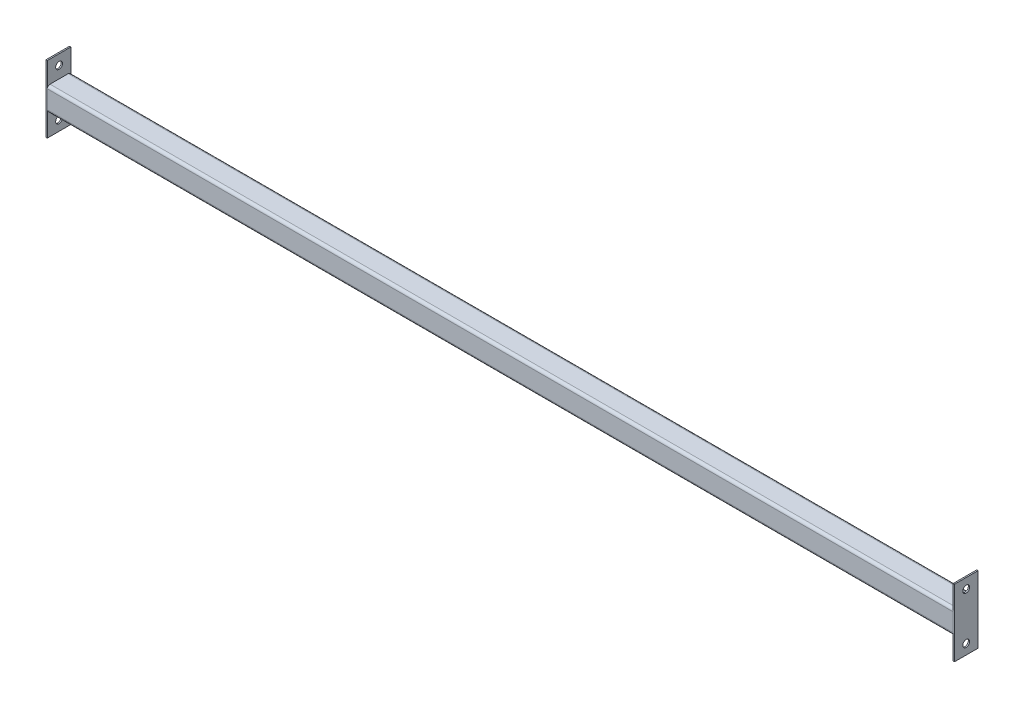
ISO-10303-21;
HEADER;
FILE_DESCRIPTION(('STEP AP214'),'2;1');
FILE_NAME('part.step','',(''),(''),'','','');
FILE_SCHEMA(('AUTOMOTIVE_DESIGN { 1 0 10303 214 1 1 1 1 }'));
ENDSEC;
DATA;
#1=APPLICATION_CONTEXT('core data for automotive mechanical design processes');
#2=APPLICATION_PROTOCOL_DEFINITION('international standard','automotive_design',2000,#1);
#3=PRODUCT_CONTEXT('',#1,'mechanical');
#4=PRODUCT('Part','Part','',(#3));
#5=PRODUCT_RELATED_PRODUCT_CATEGORY('part','',(#4));
#6=PRODUCT_DEFINITION_FORMATION('','',#4);
#7=PRODUCT_DEFINITION_CONTEXT('part definition',#1,'design');
#8=PRODUCT_DEFINITION('design','',#6,#7);
#9=PRODUCT_DEFINITION_SHAPE('','',#8);
#10=(LENGTH_UNIT() NAMED_UNIT(*) SI_UNIT(.MILLI.,.METRE.));
#11=(NAMED_UNIT(*) PLANE_ANGLE_UNIT() SI_UNIT($,.RADIAN.));
#12=(NAMED_UNIT(*) SI_UNIT($,.STERADIAN.) SOLID_ANGLE_UNIT());
#13=UNCERTAINTY_MEASURE_WITH_UNIT(LENGTH_MEASURE(1.E-05),#10,'distance_accuracy_value','');
#14=(GEOMETRIC_REPRESENTATION_CONTEXT(3) GLOBAL_UNCERTAINTY_ASSIGNED_CONTEXT((#13)) GLOBAL_UNIT_ASSIGNED_CONTEXT((#10,
#11,#12)) REPRESENTATION_CONTEXT('',''));
#15=CARTESIAN_POINT('',(0.,0.,0.));
#16=DIRECTION('',(0.,0.,1.));
#17=DIRECTION('',(1.,0.,0.));
#18=AXIS2_PLACEMENT_3D('',#15,#16,#17);
#19=CARTESIAN_POINT('',(1349.,50.,0.));
#20=DIRECTION('',(-1.,0.,0.));
#21=DIRECTION('',(0.,0.,1.));
#22=AXIS2_PLACEMENT_3D('',#19,#20,#21);
#23=PLANE('',#22);
#24=CARTESIAN_POINT('',(1349.,63.5,13.5));
#25=DIRECTION('',(-1.,0.,0.));
#26=DIRECTION('',(0.,0.,1.));
#27=AXIS2_PLACEMENT_3D('',#24,#25,#26);
#28=CIRCLE('',#27,2.);
#29=CARTESIAN_POINT('',(1349.,63.5,15.5));
#30=VERTEX_POINT('',#29);
#31=CARTESIAN_POINT('',(1349.,65.5,13.5));
#32=VERTEX_POINT('',#31);
#33=EDGE_CURVE('E201',#30,#32,#28,.T.);
#34=ORIENTED_EDGE('',*,*,#33,.T.);
#35=DIRECTION('',(0.,0.,-1.));
#36=VECTOR('',#35,1.);
#37=CARTESIAN_POINT('',(1349.,65.5,-13.5));
#38=LINE('',#37,#36);
#39=CARTESIAN_POINT('',(1349.,65.5,-13.5));
#40=VERTEX_POINT('',#39);
#41=EDGE_CURVE('E198',#32,#40,#38,.T.);
#42=ORIENTED_EDGE('',*,*,#41,.T.);
#43=CARTESIAN_POINT('',(1349.,63.5,-13.5));
#44=DIRECTION('',(-1.,0.,0.));
#45=DIRECTION('',(0.,0.,1.));
#46=AXIS2_PLACEMENT_3D('',#43,#44,#45);
#47=CIRCLE('',#46,2.);
#48=CARTESIAN_POINT('',(1349.,63.5,-15.5));
#49=VERTEX_POINT('',#48);
#50=EDGE_CURVE('E195',#40,#49,#47,.T.);
#51=ORIENTED_EDGE('',*,*,#50,.T.);
#52=DIRECTION('',(0.,-1.,0.));
#53=VECTOR('',#52,1.);
#54=CARTESIAN_POINT('',(1349.,63.5,-15.5));
#55=LINE('',#54,#53);
#56=CARTESIAN_POINT('',(1349.,36.5,-15.5));
#57=VERTEX_POINT('',#56);
#58=EDGE_CURVE('E192',#49,#57,#55,.T.);
#59=ORIENTED_EDGE('',*,*,#58,.T.);
#60=CARTESIAN_POINT('',(1349.,36.5,-13.5));
#61=DIRECTION('',(-1.,0.,0.));
#62=DIRECTION('',(0.,0.,1.));
#63=AXIS2_PLACEMENT_3D('',#60,#61,#62);
#64=CIRCLE('',#63,1.99999999999999);
#65=CARTESIAN_POINT('',(1349.,34.5,-13.5));
#66=VERTEX_POINT('',#65);
#67=EDGE_CURVE('E189',#57,#66,#64,.T.);
#68=ORIENTED_EDGE('',*,*,#67,.T.);
#69=DIRECTION('',(0.,0.,1.));
#70=VECTOR('',#69,1.);
#71=CARTESIAN_POINT('',(1349.,34.5,13.5));
#72=LINE('',#71,#70);
#73=CARTESIAN_POINT('',(1349.,34.5,13.5));
#74=VERTEX_POINT('',#73);
#75=EDGE_CURVE('E186',#66,#74,#72,.T.);
#76=ORIENTED_EDGE('',*,*,#75,.T.);
#77=CARTESIAN_POINT('',(1349.,36.5,13.5));
#78=DIRECTION('',(-1.,0.,0.));
#79=DIRECTION('',(0.,0.,1.));
#80=AXIS2_PLACEMENT_3D('',#77,#78,#79);
#81=CIRCLE('',#80,1.99999999999999);
#82=CARTESIAN_POINT('',(1349.,36.5,15.5));
#83=VERTEX_POINT('',#82);
#84=EDGE_CURVE('E183',#74,#83,#81,.T.);
#85=ORIENTED_EDGE('',*,*,#84,.T.);
#86=DIRECTION('',(0.,1.,0.));
#87=VECTOR('',#86,1.);
#88=CARTESIAN_POINT('',(1349.,36.5,15.5));
#89=LINE('',#88,#87);
#90=EDGE_CURVE('E180',#83,#30,#89,.T.);
#91=ORIENTED_EDGE('',*,*,#90,.T.);
#92=EDGE_LOOP('',(#34,#42,#51,#59,#68,#76,#85,#91));
#93=FACE_BOUND('',#92,.T.);
#94=DIRECTION('',(0.,0.,-1.));
#95=VECTOR('',#94,1.);
#96=CARTESIAN_POINT('',(1349.,67.5,-13.5));
#97=LINE('',#96,#95);
#98=CARTESIAN_POINT('',(1349.,67.5,13.5));
#99=VERTEX_POINT('',#98);
#100=CARTESIAN_POINT('',(1349.,67.5,-13.5));
#101=VERTEX_POINT('',#100);
#102=EDGE_CURVE('E144',#99,#101,#97,.T.);
#103=ORIENTED_EDGE('',*,*,#102,.F.);
#104=CARTESIAN_POINT('',(1349.,63.5,13.5));
#105=DIRECTION('',(-1.,0.,0.));
#106=DIRECTION('',(0.,0.,1.));
#107=AXIS2_PLACEMENT_3D('',#104,#105,#106);
#108=CIRCLE('',#107,4.);
#109=CARTESIAN_POINT('',(1349.,63.5,17.5));
#110=VERTEX_POINT('',#109);
#111=EDGE_CURVE('E147',#110,#99,#108,.T.);
#112=ORIENTED_EDGE('',*,*,#111,.F.);
#113=DIRECTION('',(0.,1.,0.));
#114=VECTOR('',#113,1.);
#115=CARTESIAN_POINT('',(1349.,36.5,17.5));
#116=LINE('',#115,#114);
#117=CARTESIAN_POINT('',(1349.,36.5,17.5));
#118=VERTEX_POINT('',#117);
#119=EDGE_CURVE('E177',#118,#110,#116,.T.);
#120=ORIENTED_EDGE('',*,*,#119,.F.);
#121=CARTESIAN_POINT('',(1349.,36.5,13.5));
#122=DIRECTION('',(-1.,0.,0.));
#123=DIRECTION('',(0.,0.,1.));
#124=AXIS2_PLACEMENT_3D('',#121,#122,#123);
#125=CIRCLE('',#124,4.);
#126=CARTESIAN_POINT('',(1349.,32.5,13.5));
#127=VERTEX_POINT('',#126);
#128=EDGE_CURVE('E219',#127,#118,#125,.T.);
#129=ORIENTED_EDGE('',*,*,#128,.F.);
#130=DIRECTION('',(0.,0.,1.));
#131=VECTOR('',#130,1.);
#132=CARTESIAN_POINT('',(1349.,32.5,13.5));
#133=LINE('',#132,#131);
#134=CARTESIAN_POINT('',(1349.,32.5,-13.5));
#135=VERTEX_POINT('',#134);
#136=EDGE_CURVE('E214',#135,#127,#133,.T.);
#137=ORIENTED_EDGE('',*,*,#136,.F.);
#138=CARTESIAN_POINT('',(1349.,36.5,-13.5));
#139=DIRECTION('',(-1.,0.,0.));
#140=DIRECTION('',(0.,0.,1.));
#141=AXIS2_PLACEMENT_3D('',#138,#139,#140);
#142=CIRCLE('',#141,4.);
#143=CARTESIAN_POINT('',(1349.,36.5,-17.5));
#144=VERTEX_POINT('',#143);
#145=EDGE_CURVE('E209',#144,#135,#142,.T.);
#146=ORIENTED_EDGE('',*,*,#145,.F.);
#147=DIRECTION('',(0.,-1.,0.));
#148=VECTOR('',#147,1.);
#149=CARTESIAN_POINT('',(1349.,63.5,-17.5));
#150=LINE('',#149,#148);
#151=CARTESIAN_POINT('',(1349.,63.5,-17.5));
#152=VERTEX_POINT('',#151);
#153=EDGE_CURVE('E205',#152,#144,#150,.T.);
#154=ORIENTED_EDGE('',*,*,#153,.F.);
#155=CARTESIAN_POINT('',(1349.,63.5,-13.5));
#156=DIRECTION('',(-1.,0.,0.));
#157=DIRECTION('',(0.,0.,1.));
#158=AXIS2_PLACEMENT_3D('',#155,#156,#157);
#159=CIRCLE('',#158,4.);
#160=EDGE_CURVE('E151',#101,#152,#159,.T.);
#161=ORIENTED_EDGE('',*,*,#160,.F.);
#162=EDGE_LOOP('',(#103,#112,#120,#129,#137,#146,#154,#161));
#163=FACE_BOUND('',#162,.T.);
#164=ADVANCED_FACE('F87',(#93,#163),#23,.F.);
#165=CARTESIAN_POINT('',(1350.,63.5,13.5));
#166=DIRECTION('',(-1.,0.,0.));
#167=DIRECTION('',(0.,0.,1.));
#168=AXIS2_PLACEMENT_3D('',#165,#166,#167);
#169=CYLINDRICAL_SURFACE('',#168,2.);
#170=ORIENTED_EDGE('',*,*,#33,.F.);
#171=DIRECTION('',(-1.,0.,0.));
#172=VECTOR('',#171,1.);
#173=CARTESIAN_POINT('',(1350.,63.5,15.5));
#174=LINE('',#173,#172);
#175=CARTESIAN_POINT('',(0.99999999999989,63.5,15.5));
#176=VERTEX_POINT('',#175);
#177=EDGE_CURVE('E90',#30,#176,#174,.T.);
#178=ORIENTED_EDGE('',*,*,#177,.T.);
#179=CARTESIAN_POINT('',(0.99999999999989,63.5,13.5));
#180=DIRECTION('',(1.,0.,0.));
#181=DIRECTION('',(0.,0.,-1.));
#182=AXIS2_PLACEMENT_3D('',#179,#180,#181);
#183=CIRCLE('',#182,2.);
#184=CARTESIAN_POINT('',(0.99999999999989,65.5,13.5));
#185=VERTEX_POINT('',#184);
#186=EDGE_CURVE('E228',#185,#176,#183,.T.);
#187=ORIENTED_EDGE('',*,*,#186,.F.);
#188=DIRECTION('',(-1.,0.,0.));
#189=VECTOR('',#188,1.);
#190=CARTESIAN_POINT('',(1350.,65.5,13.5));
#191=LINE('',#190,#189);
#192=EDGE_CURVE('E243',#32,#185,#191,.T.);
#193=ORIENTED_EDGE('',*,*,#192,.F.);
#194=EDGE_LOOP('',(#170,#178,#187,#193));
#195=FACE_BOUND('',#194,.T.);
#196=ADVANCED_FACE('F254',(#195),#169,.F.);
#197=CARTESIAN_POINT('',(1350.,65.5,-13.5));
#198=DIRECTION('',(0.,-1.,0.));
#199=DIRECTION('',(0.,0.,-1.));
#200=AXIS2_PLACEMENT_3D('',#197,#198,#199);
#201=PLANE('',#200);
#202=ORIENTED_EDGE('',*,*,#41,.F.);
#203=ORIENTED_EDGE('',*,*,#192,.T.);
#204=DIRECTION('',(0.,0.,1.));
#205=VECTOR('',#204,1.);
#206=CARTESIAN_POINT('',(0.99999999999989,65.5,-13.5));
#207=LINE('',#206,#205);
#208=CARTESIAN_POINT('',(0.99999999999989,65.5,-13.5));
#209=VERTEX_POINT('',#208);
#210=EDGE_CURVE('E267',#209,#185,#207,.T.);
#211=ORIENTED_EDGE('',*,*,#210,.F.);
#212=DIRECTION('',(-1.,0.,0.));
#213=VECTOR('',#212,1.);
#214=CARTESIAN_POINT('',(1350.,65.5,-13.5));
#215=LINE('',#214,#213);
#216=EDGE_CURVE('E241',#40,#209,#215,.T.);
#217=ORIENTED_EDGE('',*,*,#216,.F.);
#218=EDGE_LOOP('',(#202,#203,#211,#217));
#219=FACE_BOUND('',#218,.T.);
#220=ADVANCED_FACE('F376',(#219),#201,.T.);
#221=CARTESIAN_POINT('',(1350.,63.5,-13.5));
#222=DIRECTION('',(-1.,0.,0.));
#223=DIRECTION('',(0.,0.,1.));
#224=AXIS2_PLACEMENT_3D('',#221,#222,#223);
#225=CYLINDRICAL_SURFACE('',#224,2.);
#226=ORIENTED_EDGE('',*,*,#50,.F.);
#227=ORIENTED_EDGE('',*,*,#216,.T.);
#228=CARTESIAN_POINT('',(0.99999999999989,63.5,-13.5));
#229=DIRECTION('',(1.,0.,0.));
#230=DIRECTION('',(0.,0.,-1.));
#231=AXIS2_PLACEMENT_3D('',#228,#229,#230);
#232=CIRCLE('',#231,2.);
#233=CARTESIAN_POINT('',(0.99999999999989,63.5,-15.5));
#234=VERTEX_POINT('',#233);
#235=EDGE_CURVE('E368',#234,#209,#232,.T.);
#236=ORIENTED_EDGE('',*,*,#235,.F.);
#237=DIRECTION('',(-1.,0.,0.));
#238=VECTOR('',#237,1.);
#239=CARTESIAN_POINT('',(1350.,63.5,-15.5));
#240=LINE('',#239,#238);
#241=EDGE_CURVE('E238',#49,#234,#240,.T.);
#242=ORIENTED_EDGE('',*,*,#241,.F.);
#243=EDGE_LOOP('',(#226,#227,#236,#242));
#244=FACE_BOUND('',#243,.T.);
#245=ADVANCED_FACE('F377',(#244),#225,.F.);
#246=CARTESIAN_POINT('',(1350.,63.5,-15.5));
#247=DIRECTION('',(0.,0.,1.));
#248=DIRECTION('',(1.,0.,0.));
#249=AXIS2_PLACEMENT_3D('',#246,#247,#248);
#250=PLANE('',#249);
#251=ORIENTED_EDGE('',*,*,#58,.F.);
#252=ORIENTED_EDGE('',*,*,#241,.T.);
#253=DIRECTION('',(0.,1.,0.));
#254=VECTOR('',#253,1.);
#255=CARTESIAN_POINT('',(0.99999999999989,63.5,-15.5));
#256=LINE('',#255,#254);
#257=CARTESIAN_POINT('',(0.99999999999989,36.5,-15.5));
#258=VERTEX_POINT('',#257);
#259=EDGE_CURVE('E366',#258,#234,#256,.T.);
#260=ORIENTED_EDGE('',*,*,#259,.F.);
#261=DIRECTION('',(-1.,0.,0.));
#262=VECTOR('',#261,1.);
#263=CARTESIAN_POINT('',(1350.,36.5,-15.5));
#264=LINE('',#263,#262);
#265=EDGE_CURVE('E235',#57,#258,#264,.T.);
#266=ORIENTED_EDGE('',*,*,#265,.F.);
#267=EDGE_LOOP('',(#251,#252,#260,#266));
#268=FACE_BOUND('',#267,.T.);
#269=ADVANCED_FACE('F379',(#268),#250,.T.);
#270=CARTESIAN_POINT('',(1350.,36.5,-13.5));
#271=DIRECTION('',(-1.,0.,0.));
#272=DIRECTION('',(0.,0.,1.));
#273=AXIS2_PLACEMENT_3D('',#270,#271,#272);
#274=CYLINDRICAL_SURFACE('',#273,1.99999999999999);
#275=ORIENTED_EDGE('',*,*,#67,.F.);
#276=ORIENTED_EDGE('',*,*,#265,.T.);
#277=CARTESIAN_POINT('',(0.99999999999989,36.5,-13.5));
#278=DIRECTION('',(1.,0.,0.));
#279=DIRECTION('',(0.,0.,-1.));
#280=AXIS2_PLACEMENT_3D('',#277,#278,#279);
#281=CIRCLE('',#280,1.99999999999999);
#282=CARTESIAN_POINT('',(0.99999999999989,34.5,-13.5));
#283=VERTEX_POINT('',#282);
#284=EDGE_CURVE('E363',#283,#258,#281,.T.);
#285=ORIENTED_EDGE('',*,*,#284,.F.);
#286=DIRECTION('',(-1.,0.,0.));
#287=VECTOR('',#286,1.);
#288=CARTESIAN_POINT('',(1350.,34.5,-13.5));
#289=LINE('',#288,#287);
#290=EDGE_CURVE('E232',#66,#283,#289,.T.);
#291=ORIENTED_EDGE('',*,*,#290,.F.);
#292=EDGE_LOOP('',(#275,#276,#285,#291));
#293=FACE_BOUND('',#292,.T.);
#294=ADVANCED_FACE('F360',(#293),#274,.F.);
#295=CARTESIAN_POINT('',(1350.,34.5,13.5));
#296=DIRECTION('',(0.,1.,0.));
#297=DIRECTION('',(0.,0.,1.));
#298=AXIS2_PLACEMENT_3D('',#295,#296,#297);
#299=PLANE('',#298);
#300=ORIENTED_EDGE('',*,*,#75,.F.);
#301=ORIENTED_EDGE('',*,*,#290,.T.);
#302=DIRECTION('',(0.,0.,-1.));
#303=VECTOR('',#302,1.);
#304=CARTESIAN_POINT('',(0.99999999999989,34.5,13.5));
#305=LINE('',#304,#303);
#306=CARTESIAN_POINT('',(0.99999999999989,34.5,13.5));
#307=VERTEX_POINT('',#306);
#308=EDGE_CURVE('E273',#307,#283,#305,.T.);
#309=ORIENTED_EDGE('',*,*,#308,.F.);
#310=DIRECTION('',(-1.,0.,0.));
#311=VECTOR('',#310,1.);
#312=CARTESIAN_POINT('',(1350.,34.5,13.5));
#313=LINE('',#312,#311);
#314=EDGE_CURVE('E229',#74,#307,#313,.T.);
#315=ORIENTED_EDGE('',*,*,#314,.F.);
#316=EDGE_LOOP('',(#300,#301,#309,#315));
#317=FACE_BOUND('',#316,.T.);
#318=ADVANCED_FACE('F355',(#317),#299,.T.);
#319=CARTESIAN_POINT('',(1350.,36.5,13.5));
#320=DIRECTION('',(-1.,0.,0.));
#321=DIRECTION('',(0.,0.,1.));
#322=AXIS2_PLACEMENT_3D('',#319,#320,#321);
#323=CYLINDRICAL_SURFACE('',#322,1.99999999999999);
#324=ORIENTED_EDGE('',*,*,#84,.F.);
#325=ORIENTED_EDGE('',*,*,#314,.T.);
#326=CARTESIAN_POINT('',(0.99999999999989,36.5,13.5));
#327=DIRECTION('',(1.,0.,0.));
#328=DIRECTION('',(0.,0.,-1.));
#329=AXIS2_PLACEMENT_3D('',#326,#327,#328);
#330=CIRCLE('',#329,1.99999999999999);
#331=CARTESIAN_POINT('',(0.99999999999989,36.5,15.5));
#332=VERTEX_POINT('',#331);
#333=EDGE_CURVE('E271',#332,#307,#330,.T.);
#334=ORIENTED_EDGE('',*,*,#333,.F.);
#335=DIRECTION('',(-1.,0.,0.));
#336=VECTOR('',#335,1.);
#337=CARTESIAN_POINT('',(1350.,36.5,15.5));
#338=LINE('',#337,#336);
#339=EDGE_CURVE('E225',#83,#332,#338,.T.);
#340=ORIENTED_EDGE('',*,*,#339,.F.);
#341=EDGE_LOOP('',(#324,#325,#334,#340));
#342=FACE_BOUND('',#341,.T.);
#343=ADVANCED_FACE('F351',(#342),#323,.F.);
#344=CARTESIAN_POINT('',(1350.,36.5,15.5));
#345=DIRECTION('',(0.,0.,-1.));
#346=DIRECTION('',(-1.,0.,0.));
#347=AXIS2_PLACEMENT_3D('',#344,#345,#346);
#348=PLANE('',#347);
#349=ORIENTED_EDGE('',*,*,#90,.F.);
#350=ORIENTED_EDGE('',*,*,#339,.T.);
#351=DIRECTION('',(0.,-1.,0.));
#352=VECTOR('',#351,1.);
#353=CARTESIAN_POINT('',(0.99999999999989,36.5,15.5));
#354=LINE('',#353,#352);
#355=EDGE_CURVE('E264',#176,#332,#354,.T.);
#356=ORIENTED_EDGE('',*,*,#355,.F.);
#357=ORIENTED_EDGE('',*,*,#177,.F.);
#358=EDGE_LOOP('',(#349,#350,#356,#357));
#359=FACE_BOUND('',#358,.T.);
#360=ADVANCED_FACE('F269',(#359),#348,.T.);
#361=CARTESIAN_POINT('',(0.999999999999995,50.,0.));
#362=DIRECTION('',(1.,0.,0.));
#363=DIRECTION('',(0.,0.,-1.));
#364=AXIS2_PLACEMENT_3D('',#361,#362,#363);
#365=PLANE('',#364);
#366=ORIENTED_EDGE('',*,*,#186,.T.);
#367=ORIENTED_EDGE('',*,*,#355,.T.);
#368=ORIENTED_EDGE('',*,*,#333,.T.);
#369=ORIENTED_EDGE('',*,*,#308,.T.);
#370=ORIENTED_EDGE('',*,*,#284,.T.);
#371=ORIENTED_EDGE('',*,*,#259,.T.);
#372=ORIENTED_EDGE('',*,*,#235,.T.);
#373=ORIENTED_EDGE('',*,*,#210,.T.);
#374=EDGE_LOOP('',(#366,#367,#368,#369,#370,#371,#372,#373));
#375=FACE_BOUND('',#374,.T.);
#376=DIRECTION('',(0.,1.,0.));
#377=VECTOR('',#376,1.);
#378=CARTESIAN_POINT('',(0.99999999999989,63.5,-17.5));
#379=LINE('',#378,#377);
#380=CARTESIAN_POINT('',(0.99999999999989,36.5,-17.5));
#381=VERTEX_POINT('',#380);
#382=CARTESIAN_POINT('',(0.99999999999989,63.5,-17.5));
#383=VERTEX_POINT('',#382);
#384=EDGE_CURVE('E14',#381,#383,#379,.T.);
#385=ORIENTED_EDGE('',*,*,#384,.F.);
#386=CARTESIAN_POINT('',(0.99999999999989,36.5,-13.5));
#387=DIRECTION('',(1.,0.,0.));
#388=DIRECTION('',(0.,0.,-1.));
#389=AXIS2_PLACEMENT_3D('',#386,#387,#388);
#390=CIRCLE('',#389,4.);
#391=CARTESIAN_POINT('',(0.99999999999989,32.5,-13.5));
#392=VERTEX_POINT('',#391);
#393=EDGE_CURVE('E208',#392,#381,#390,.T.);
#394=ORIENTED_EDGE('',*,*,#393,.F.);
#395=DIRECTION('',(0.,0.,-1.));
#396=VECTOR('',#395,1.);
#397=CARTESIAN_POINT('',(0.99999999999989,32.5,13.5));
#398=LINE('',#397,#396);
#399=CARTESIAN_POINT('',(0.99999999999989,32.5,13.5));
#400=VERTEX_POINT('',#399);
#401=EDGE_CURVE('E213',#400,#392,#398,.T.);
#402=ORIENTED_EDGE('',*,*,#401,.F.);
#403=CARTESIAN_POINT('',(0.99999999999989,36.5,13.5));
#404=DIRECTION('',(1.,0.,0.));
#405=DIRECTION('',(0.,0.,-1.));
#406=AXIS2_PLACEMENT_3D('',#403,#404,#405);
#407=CIRCLE('',#406,4.);
#408=CARTESIAN_POINT('',(0.99999999999989,36.5,17.5));
#409=VERTEX_POINT('',#408);
#410=EDGE_CURVE('E218',#409,#400,#407,.T.);
#411=ORIENTED_EDGE('',*,*,#410,.F.);
#412=DIRECTION('',(0.,-1.,0.));
#413=VECTOR('',#412,1.);
#414=CARTESIAN_POINT('',(0.99999999999989,36.5,17.5));
#415=LINE('',#414,#413);
#416=CARTESIAN_POINT('',(0.99999999999989,63.5,17.5));
#417=VERTEX_POINT('',#416);
#418=EDGE_CURVE('E220',#417,#409,#415,.T.);
#419=ORIENTED_EDGE('',*,*,#418,.F.);
#420=CARTESIAN_POINT('',(0.99999999999989,63.5,13.5));
#421=DIRECTION('',(1.,0.,0.));
#422=DIRECTION('',(0.,0.,-1.));
#423=AXIS2_PLACEMENT_3D('',#420,#421,#422);
#424=CIRCLE('',#423,4.);
#425=CARTESIAN_POINT('',(0.99999999999989,67.5,13.5));
#426=VERTEX_POINT('',#425);
#427=EDGE_CURVE('E168',#426,#417,#424,.T.);
#428=ORIENTED_EDGE('',*,*,#427,.F.);
#429=DIRECTION('',(0.,0.,1.));
#430=VECTOR('',#429,1.);
#431=CARTESIAN_POINT('',(0.99999999999989,67.5,-13.5));
#432=LINE('',#431,#430);
#433=CARTESIAN_POINT('',(0.99999999999989,67.5,-13.5));
#434=VERTEX_POINT('',#433);
#435=EDGE_CURVE('E164',#434,#426,#432,.T.);
#436=ORIENTED_EDGE('',*,*,#435,.F.);
#437=CARTESIAN_POINT('',(0.99999999999989,63.5,-13.5));
#438=DIRECTION('',(1.,0.,0.));
#439=DIRECTION('',(0.,0.,-1.));
#440=AXIS2_PLACEMENT_3D('',#437,#438,#439);
#441=CIRCLE('',#440,4.);
#442=EDGE_CURVE('E156',#383,#434,#441,.T.);
#443=ORIENTED_EDGE('',*,*,#442,.F.);
#444=EDGE_LOOP('',(#385,#394,#402,#411,#419,#428,#436,#443));
#445=FACE_BOUND('',#444,.T.);
#446=ADVANCED_FACE('F260',(#375,#445),#365,.F.);
#447=CARTESIAN_POINT('',(1350.,63.5,-13.5));
#448=DIRECTION('',(-1.,0.,0.));
#449=DIRECTION('',(0.,0.,1.));
#450=AXIS2_PLACEMENT_3D('',#447,#448,#449);
#451=CYLINDRICAL_SURFACE('',#450,4.);
#452=DIRECTION('',(-1.,0.,0.));
#453=VECTOR('',#452,1.);
#454=CARTESIAN_POINT('',(1350.,67.5,-13.5));
#455=LINE('',#454,#453);
#456=EDGE_CURVE('E155',#101,#434,#455,.T.);
#457=ORIENTED_EDGE('',*,*,#456,.F.);
#458=ORIENTED_EDGE('',*,*,#160,.T.);
#459=DIRECTION('',(-1.,0.,0.));
#460=VECTOR('',#459,1.);
#461=CARTESIAN_POINT('',(1350.,63.5,-17.5));
#462=LINE('',#461,#460);
#463=EDGE_CURVE('E223',#152,#383,#462,.T.);
#464=ORIENTED_EDGE('',*,*,#463,.T.);
#465=ORIENTED_EDGE('',*,*,#442,.T.);
#466=EDGE_LOOP('',(#457,#458,#464,#465));
#467=FACE_BOUND('',#466,.T.);
#468=ADVANCED_FACE('F320',(#467),#451,.T.);
#469=CARTESIAN_POINT('',(1350.,67.5,-13.5));
#470=DIRECTION('',(0.,-1.,0.));
#471=DIRECTION('',(0.,0.,-1.));
#472=AXIS2_PLACEMENT_3D('',#469,#470,#471);
#473=PLANE('',#472);
#474=DIRECTION('',(-1.,0.,0.));
#475=VECTOR('',#474,1.);
#476=CARTESIAN_POINT('',(1350.,67.5,13.5));
#477=LINE('',#476,#475);
#478=EDGE_CURVE('E160',#99,#426,#477,.T.);
#479=ORIENTED_EDGE('',*,*,#478,.F.);
#480=ORIENTED_EDGE('',*,*,#102,.T.);
#481=ORIENTED_EDGE('',*,*,#456,.T.);
#482=ORIENTED_EDGE('',*,*,#435,.T.);
#483=EDGE_LOOP('',(#479,#480,#481,#482));
#484=FACE_BOUND('',#483,.T.);
#485=ADVANCED_FACE('F161',(#484),#473,.F.);
#486=CARTESIAN_POINT('',(1350.,63.5,13.5));
#487=DIRECTION('',(-1.,0.,0.));
#488=DIRECTION('',(0.,0.,1.));
#489=AXIS2_PLACEMENT_3D('',#486,#487,#488);
#490=CYLINDRICAL_SURFACE('',#489,4.);
#491=DIRECTION('',(-1.,0.,0.));
#492=VECTOR('',#491,1.);
#493=CARTESIAN_POINT('',(1350.,63.5,17.5));
#494=LINE('',#493,#492);
#495=EDGE_CURVE('E172',#110,#417,#494,.T.);
#496=ORIENTED_EDGE('',*,*,#495,.F.);
#497=ORIENTED_EDGE('',*,*,#111,.T.);
#498=ORIENTED_EDGE('',*,*,#478,.T.);
#499=ORIENTED_EDGE('',*,*,#427,.T.);
#500=EDGE_LOOP('',(#496,#497,#498,#499));
#501=FACE_BOUND('',#500,.T.);
#502=ADVANCED_FACE('F170',(#501),#490,.T.);
#503=CARTESIAN_POINT('',(1350.,36.5,17.5));
#504=DIRECTION('',(0.,0.,-1.));
#505=DIRECTION('',(-1.,0.,0.));
#506=AXIS2_PLACEMENT_3D('',#503,#504,#505);
#507=PLANE('',#506);
#508=DIRECTION('',(-1.,0.,0.));
#509=VECTOR('',#508,1.);
#510=CARTESIAN_POINT('',(1350.,36.5,17.5));
#511=LINE('',#510,#509);
#512=EDGE_CURVE('E215',#118,#409,#511,.T.);
#513=ORIENTED_EDGE('',*,*,#512,.F.);
#514=ORIENTED_EDGE('',*,*,#119,.T.);
#515=ORIENTED_EDGE('',*,*,#495,.T.);
#516=ORIENTED_EDGE('',*,*,#418,.T.);
#517=EDGE_LOOP('',(#513,#514,#515,#516));
#518=FACE_BOUND('',#517,.T.);
#519=ADVANCED_FACE('F302',(#518),#507,.F.);
#520=CARTESIAN_POINT('',(1350.,36.5,13.5));
#521=DIRECTION('',(-1.,0.,0.));
#522=DIRECTION('',(0.,0.,1.));
#523=AXIS2_PLACEMENT_3D('',#520,#521,#522);
#524=CYLINDRICAL_SURFACE('',#523,4.);
#525=DIRECTION('',(-1.,0.,0.));
#526=VECTOR('',#525,1.);
#527=CARTESIAN_POINT('',(1350.,32.5,13.5));
#528=LINE('',#527,#526);
#529=EDGE_CURVE('E210',#127,#400,#528,.T.);
#530=ORIENTED_EDGE('',*,*,#529,.F.);
#531=ORIENTED_EDGE('',*,*,#128,.T.);
#532=ORIENTED_EDGE('',*,*,#512,.T.);
#533=ORIENTED_EDGE('',*,*,#410,.T.);
#534=EDGE_LOOP('',(#530,#531,#532,#533));
#535=FACE_BOUND('',#534,.T.);
#536=ADVANCED_FACE('F296',(#535),#524,.T.);
#537=CARTESIAN_POINT('',(1350.,32.5,13.5));
#538=DIRECTION('',(0.,1.,0.));
#539=DIRECTION('',(0.,0.,1.));
#540=AXIS2_PLACEMENT_3D('',#537,#538,#539);
#541=PLANE('',#540);
#542=DIRECTION('',(-1.,0.,0.));
#543=VECTOR('',#542,1.);
#544=CARTESIAN_POINT('',(1350.,32.5,-13.5));
#545=LINE('',#544,#543);
#546=EDGE_CURVE('E206',#135,#392,#545,.T.);
#547=ORIENTED_EDGE('',*,*,#546,.F.);
#548=ORIENTED_EDGE('',*,*,#136,.T.);
#549=ORIENTED_EDGE('',*,*,#529,.T.);
#550=ORIENTED_EDGE('',*,*,#401,.T.);
#551=EDGE_LOOP('',(#547,#548,#549,#550));
#552=FACE_BOUND('',#551,.T.);
#553=ADVANCED_FACE('F311',(#552),#541,.F.);
#554=CARTESIAN_POINT('',(1350.,36.5,-13.5));
#555=DIRECTION('',(-1.,0.,0.));
#556=DIRECTION('',(0.,0.,1.));
#557=AXIS2_PLACEMENT_3D('',#554,#555,#556);
#558=CYLINDRICAL_SURFACE('',#557,4.);
#559=DIRECTION('',(-1.,0.,0.));
#560=VECTOR('',#559,1.);
#561=CARTESIAN_POINT('',(1350.,36.5,-17.5));
#562=LINE('',#561,#560);
#563=EDGE_CURVE('E96',#144,#381,#562,.T.);
#564=ORIENTED_EDGE('',*,*,#563,.F.);
#565=ORIENTED_EDGE('',*,*,#145,.T.);
#566=ORIENTED_EDGE('',*,*,#546,.T.);
#567=ORIENTED_EDGE('',*,*,#393,.T.);
#568=EDGE_LOOP('',(#564,#565,#566,#567));
#569=FACE_BOUND('',#568,.T.);
#570=ADVANCED_FACE('F315',(#569),#558,.T.);
#571=CARTESIAN_POINT('',(1350.,63.5,-17.5));
#572=DIRECTION('',(0.,0.,1.));
#573=DIRECTION('',(1.,0.,0.));
#574=AXIS2_PLACEMENT_3D('',#571,#572,#573);
#575=PLANE('',#574);
#576=ORIENTED_EDGE('',*,*,#463,.F.);
#577=ORIENTED_EDGE('',*,*,#153,.T.);
#578=ORIENTED_EDGE('',*,*,#563,.T.);
#579=ORIENTED_EDGE('',*,*,#384,.T.);
#580=EDGE_LOOP('',(#576,#577,#578,#579));
#581=FACE_BOUND('',#580,.T.);
#582=ADVANCED_FACE('F318',(#581),#575,.F.);
#583=CLOSED_SHELL('',(#164,#196,#220,#245,#269,#294,#318,#343,#360,#446,#468,#485,#502,#519,
#536,#553,#570,#582));
#584=MANIFOLD_SOLID_BREP('B2',#583);
#585=CARTESIAN_POINT('',(1349.,100.,17.5));
#586=DIRECTION('',(1.,0.,0.));
#587=DIRECTION('',(0.,0.,-1.));
#588=AXIS2_PLACEMENT_3D('',#585,#586,#587);
#589=PLANE('',#588);
#590=CARTESIAN_POINT('',(1349.,15.,0.));
#591=DIRECTION('',(1.,0.,0.));
#592=DIRECTION('',(0.,0.,-1.));
#593=AXIS2_PLACEMENT_3D('',#590,#591,#592);
#594=CIRCLE('',#593,5.09999999999975);
#595=CARTESIAN_POINT('',(1349.,15.,-5.09999999999974));
#596=VERTEX_POINT('',#595);
#597=EDGE_CURVE('E651',#596,#596,#594,.T.);
#598=ORIENTED_EDGE('',*,*,#597,.T.);
#599=EDGE_LOOP('',(#598));
#600=FACE_BOUND('',#599,.T.);
#601=CARTESIAN_POINT('',(1349.,85.,0.));
#602=DIRECTION('',(1.,0.,0.));
#603=DIRECTION('',(0.,0.,-1.));
#604=AXIS2_PLACEMENT_3D('',#601,#602,#603);
#605=CIRCLE('',#604,5.09999999999974);
#606=CARTESIAN_POINT('',(1349.,85.,-5.09999999999974));
#607=VERTEX_POINT('',#606);
#608=EDGE_CURVE('E635',#607,#607,#605,.T.);
#609=ORIENTED_EDGE('',*,*,#608,.T.);
#610=EDGE_LOOP('',(#609));
#611=FACE_BOUND('',#610,.T.);
#612=DIRECTION('',(0.,0.,1.));
#613=VECTOR('',#612,1.);
#614=CARTESIAN_POINT('',(1349.,0.,17.5));
#615=LINE('',#614,#613);
#616=CARTESIAN_POINT('',(1349.,0.,-17.5));
#617=VERTEX_POINT('',#616);
#618=CARTESIAN_POINT('',(1349.,0.,17.5));
#619=VERTEX_POINT('',#618);
#620=EDGE_CURVE('E632',#617,#619,#615,.T.);
#621=ORIENTED_EDGE('',*,*,#620,.T.);
#622=DIRECTION('',(0.,-1.,0.));
#623=VECTOR('',#622,1.);
#624=CARTESIAN_POINT('',(1349.,100.,17.5));
#625=LINE('',#624,#623);
#626=CARTESIAN_POINT('',(1349.,100.,17.5));
#627=VERTEX_POINT('',#626);
#628=EDGE_CURVE('E85',#627,#619,#625,.T.);
#629=ORIENTED_EDGE('',*,*,#628,.F.);
#630=DIRECTION('',(0.,0.,1.));
#631=VECTOR('',#630,1.);
#632=CARTESIAN_POINT('',(1349.,100.,17.5));
#633=LINE('',#632,#631);
#634=CARTESIAN_POINT('',(1349.,100.,-17.5));
#635=VERTEX_POINT('',#634);
#636=EDGE_CURVE('E620',#635,#627,#633,.T.);
#637=ORIENTED_EDGE('',*,*,#636,.F.);
#638=DIRECTION('',(0.,-1.,0.));
#639=VECTOR('',#638,1.);
#640=CARTESIAN_POINT('',(1349.,100.,-17.5));
#641=LINE('',#640,#639);
#642=EDGE_CURVE('E628',#635,#617,#641,.T.);
#643=ORIENTED_EDGE('',*,*,#642,.T.);
#644=EDGE_LOOP('',(#621,#629,#637,#643));
#645=FACE_BOUND('',#644,.T.);
#646=ADVANCED_FACE('F569',(#600,#611,#645),#589,.F.);
#647=CARTESIAN_POINT('',(1351.,100.,17.5));
#648=DIRECTION('',(0.,0.,-1.));
#649=DIRECTION('',(-1.,0.,0.));
#650=AXIS2_PLACEMENT_3D('',#647,#648,#649);
#651=PLANE('',#650);
#652=DIRECTION('',(1.,0.,0.));
#653=VECTOR('',#652,1.);
#654=CARTESIAN_POINT('',(1351.,0.,17.5));
#655=LINE('',#654,#653);
#656=CARTESIAN_POINT('',(1351.,0.,17.5));
#657=VERTEX_POINT('',#656);
#658=EDGE_CURVE('E624',#619,#657,#655,.T.);
#659=ORIENTED_EDGE('',*,*,#658,.T.);
#660=DIRECTION('',(0.,-1.,0.));
#661=VECTOR('',#660,1.);
#662=CARTESIAN_POINT('',(1351.,100.,17.5));
#663=LINE('',#662,#661);
#664=CARTESIAN_POINT('',(1351.,100.,17.5));
#665=VERTEX_POINT('',#664);
#666=EDGE_CURVE('E577',#665,#657,#663,.T.);
#667=ORIENTED_EDGE('',*,*,#666,.F.);
#668=DIRECTION('',(1.,0.,0.));
#669=VECTOR('',#668,1.);
#670=CARTESIAN_POINT('',(1351.,100.,17.5));
#671=LINE('',#670,#669);
#672=EDGE_CURVE('E615',#627,#665,#671,.T.);
#673=ORIENTED_EDGE('',*,*,#672,.F.);
#674=ORIENTED_EDGE('',*,*,#628,.T.);
#675=EDGE_LOOP('',(#659,#667,#673,#674));
#676=FACE_BOUND('',#675,.T.);
#677=ADVANCED_FACE('F623',(#676),#651,.F.);
#678=CARTESIAN_POINT('',(1351.,100.,17.5));
#679=DIRECTION('',(-1.,0.,0.));
#680=DIRECTION('',(0.,0.,1.));
#681=AXIS2_PLACEMENT_3D('',#678,#679,#680);
#682=PLANE('',#681);
#683=CARTESIAN_POINT('',(1351.,15.,0.));
#684=DIRECTION('',(-1.,0.,0.));
#685=DIRECTION('',(0.,0.,1.));
#686=AXIS2_PLACEMENT_3D('',#683,#684,#685);
#687=CIRCLE('',#686,5.09999999999967);
#688=CARTESIAN_POINT('',(1351.,15.,5.09999999999968));
#689=VERTEX_POINT('',#688);
#690=EDGE_CURVE('E654',#689,#689,#687,.T.);
#691=ORIENTED_EDGE('',*,*,#690,.T.);
#692=EDGE_LOOP('',(#691));
#693=FACE_BOUND('',#692,.T.);
#694=CARTESIAN_POINT('',(1351.,85.,0.));
#695=DIRECTION('',(-1.,0.,0.));
#696=DIRECTION('',(0.,0.,1.));
#697=AXIS2_PLACEMENT_3D('',#694,#695,#696);
#698=CIRCLE('',#697,5.09999999999967);
#699=CARTESIAN_POINT('',(1351.,85.,5.09999999999968));
#700=VERTEX_POINT('',#699);
#701=EDGE_CURVE('E648',#700,#700,#698,.T.);
#702=ORIENTED_EDGE('',*,*,#701,.T.);
#703=EDGE_LOOP('',(#702));
#704=FACE_BOUND('',#703,.T.);
#705=DIRECTION('',(0.,0.,-1.));
#706=VECTOR('',#705,1.);
#707=CARTESIAN_POINT('',(1351.,0.,17.5));
#708=LINE('',#707,#706);
#709=CARTESIAN_POINT('',(1351.,0.,-17.5));
#710=VERTEX_POINT('',#709);
#711=EDGE_CURVE('E602',#657,#710,#708,.T.);
#712=ORIENTED_EDGE('',*,*,#711,.T.);
#713=DIRECTION('',(0.,-1.,0.));
#714=VECTOR('',#713,1.);
#715=CARTESIAN_POINT('',(1351.,100.,-17.5));
#716=LINE('',#715,#714);
#717=CARTESIAN_POINT('',(1351.,100.,-17.5));
#718=VERTEX_POINT('',#717);
#719=EDGE_CURVE('E625',#718,#710,#716,.T.);
#720=ORIENTED_EDGE('',*,*,#719,.F.);
#721=DIRECTION('',(0.,0.,-1.));
#722=VECTOR('',#721,1.);
#723=CARTESIAN_POINT('',(1351.,100.,17.5));
#724=LINE('',#723,#722);
#725=EDGE_CURVE('E618',#665,#718,#724,.T.);
#726=ORIENTED_EDGE('',*,*,#725,.F.);
#727=ORIENTED_EDGE('',*,*,#666,.T.);
#728=EDGE_LOOP('',(#712,#720,#726,#727));
#729=FACE_BOUND('',#728,.T.);
#730=ADVANCED_FACE('F626',(#693,#704,#729),#682,.F.);
#731=CARTESIAN_POINT('',(1351.,100.,-17.5));
#732=DIRECTION('',(0.,0.,1.));
#733=DIRECTION('',(1.,0.,0.));
#734=AXIS2_PLACEMENT_3D('',#731,#732,#733);
#735=PLANE('',#734);
#736=DIRECTION('',(-1.,0.,0.));
#737=VECTOR('',#736,1.);
#738=CARTESIAN_POINT('',(1351.,0.,-17.5));
#739=LINE('',#738,#737);
#740=EDGE_CURVE('E608',#710,#617,#739,.T.);
#741=ORIENTED_EDGE('',*,*,#740,.T.);
#742=ORIENTED_EDGE('',*,*,#642,.F.);
#743=DIRECTION('',(-1.,0.,0.));
#744=VECTOR('',#743,1.);
#745=CARTESIAN_POINT('',(1351.,100.,-17.5));
#746=LINE('',#745,#744);
#747=EDGE_CURVE('E585',#718,#635,#746,.T.);
#748=ORIENTED_EDGE('',*,*,#747,.F.);
#749=ORIENTED_EDGE('',*,*,#719,.T.);
#750=EDGE_LOOP('',(#741,#742,#748,#749));
#751=FACE_BOUND('',#750,.T.);
#752=ADVANCED_FACE('F640',(#751),#735,.F.);
#753=CARTESIAN_POINT('',(1350.,100.,0.));
#754=DIRECTION('',(0.,1.,0.));
#755=DIRECTION('',(0.,0.,1.));
#756=AXIS2_PLACEMENT_3D('',#753,#754,#755);
#757=PLANE('',#756);
#758=ORIENTED_EDGE('',*,*,#636,.T.);
#759=ORIENTED_EDGE('',*,*,#672,.T.);
#760=ORIENTED_EDGE('',*,*,#725,.T.);
#761=ORIENTED_EDGE('',*,*,#747,.T.);
#762=EDGE_LOOP('',(#758,#759,#760,#761));
#763=FACE_BOUND('',#762,.T.);
#764=ADVANCED_FACE('F616',(#763),#757,.T.);
#765=CARTESIAN_POINT('',(1350.,0.,0.));
#766=DIRECTION('',(0.,1.,0.));
#767=DIRECTION('',(0.,0.,1.));
#768=AXIS2_PLACEMENT_3D('',#765,#766,#767);
#769=PLANE('',#768);
#770=ORIENTED_EDGE('',*,*,#620,.F.);
#771=ORIENTED_EDGE('',*,*,#740,.F.);
#772=ORIENTED_EDGE('',*,*,#711,.F.);
#773=ORIENTED_EDGE('',*,*,#658,.F.);
#774=EDGE_LOOP('',(#770,#771,#772,#773));
#775=FACE_BOUND('',#774,.T.);
#776=ADVANCED_FACE('F643',(#775),#769,.F.);
#777=CARTESIAN_POINT('',(-1.00000000000011,85.,0.));
#778=DIRECTION('',(-1.,0.,0.));
#779=DIRECTION('',(0.,0.,1.));
#780=AXIS2_PLACEMENT_3D('',#777,#778,#779);
#781=CYLINDRICAL_SURFACE('',#780,5.09999999999974);
#782=ORIENTED_EDGE('',*,*,#701,.F.);
#783=EDGE_LOOP('',(#782));
#784=FACE_BOUND('',#783,.T.);
#785=ORIENTED_EDGE('',*,*,#608,.F.);
#786=EDGE_LOOP('',(#785));
#787=FACE_BOUND('',#786,.T.);
#788=ADVANCED_FACE('F663',(#784,#787),#781,.F.);
#789=CARTESIAN_POINT('',(-1.00000000000011,15.,0.));
#790=DIRECTION('',(-1.,0.,0.));
#791=DIRECTION('',(0.,0.,1.));
#792=AXIS2_PLACEMENT_3D('',#789,#790,#791);
#793=CYLINDRICAL_SURFACE('',#792,5.09999999999975);
#794=ORIENTED_EDGE('',*,*,#690,.F.);
#795=EDGE_LOOP('',(#794));
#796=FACE_BOUND('',#795,.T.);
#797=ORIENTED_EDGE('',*,*,#597,.F.);
#798=EDGE_LOOP('',(#797));
#799=FACE_BOUND('',#798,.T.);
#800=ADVANCED_FACE('F660',(#796,#799),#793,.F.);
#801=CLOSED_SHELL('',(#646,#677,#730,#752,#764,#776,#788,#800));
#802=MANIFOLD_SOLID_BREP('B8',#801);
#803=CARTESIAN_POINT('',(-1.00000000000001,100.,17.5));
#804=DIRECTION('',(1.,0.,0.));
#805=DIRECTION('',(0.,0.,-1.));
#806=AXIS2_PLACEMENT_3D('',#803,#804,#805);
#807=PLANE('',#806);
#808=CARTESIAN_POINT('',(-1.00000000000001,15.,0.));
#809=DIRECTION('',(-1.,0.,0.));
#810=DIRECTION('',(0.,0.,1.));
#811=AXIS2_PLACEMENT_3D('',#808,#809,#810);
#812=CIRCLE('',#811,5.09999999999982);
#813=CARTESIAN_POINT('',(-1.00000000000001,15.,5.09999999999982));
#814=VERTEX_POINT('',#813);
#815=EDGE_CURVE('E830',#814,#814,#812,.T.);
#816=ORIENTED_EDGE('',*,*,#815,.F.);
#817=EDGE_LOOP('',(#816));
#818=FACE_BOUND('',#817,.T.);
#819=CARTESIAN_POINT('',(-1.00000000000001,85.,0.));
#820=DIRECTION('',(-1.,0.,0.));
#821=DIRECTION('',(0.,0.,1.));
#822=AXIS2_PLACEMENT_3D('',#819,#820,#821);
#823=CIRCLE('',#822,5.09999999999981);
#824=CARTESIAN_POINT('',(-1.00000000000001,85.,5.09999999999981));
#825=VERTEX_POINT('',#824);
#826=EDGE_CURVE('E827',#825,#825,#823,.T.);
#827=ORIENTED_EDGE('',*,*,#826,.F.);
#828=EDGE_LOOP('',(#827));
#829=FACE_BOUND('',#828,.T.);
#830=DIRECTION('',(0.,0.,1.));
#831=VECTOR('',#830,1.);
#832=CARTESIAN_POINT('',(-1.00000000000001,0.,17.5));
#833=LINE('',#832,#831);
#834=CARTESIAN_POINT('',(-1.00000000000001,0.,-17.5));
#835=VERTEX_POINT('',#834);
#836=CARTESIAN_POINT('',(-1.00000000000001,0.,17.5));
#837=VERTEX_POINT('',#836);
#838=EDGE_CURVE('E811',#835,#837,#833,.T.);
#839=ORIENTED_EDGE('',*,*,#838,.T.);
#840=DIRECTION('',(0.,-1.,0.));
#841=VECTOR('',#840,1.);
#842=CARTESIAN_POINT('',(-1.00000000000001,100.,17.5));
#843=LINE('',#842,#841);
#844=CARTESIAN_POINT('',(-1.00000000000001,100.,17.5));
#845=VERTEX_POINT('',#844);
#846=EDGE_CURVE('E567',#845,#837,#843,.T.);
#847=ORIENTED_EDGE('',*,*,#846,.F.);
#848=DIRECTION('',(0.,0.,1.));
#849=VECTOR('',#848,1.);
#850=CARTESIAN_POINT('',(-1.00000000000001,100.,17.5));
#851=LINE('',#850,#849);
#852=CARTESIAN_POINT('',(-1.00000000000001,100.,-17.5));
#853=VERTEX_POINT('',#852);
#854=EDGE_CURVE('E798',#853,#845,#851,.T.);
#855=ORIENTED_EDGE('',*,*,#854,.F.);
#856=DIRECTION('',(0.,-1.,0.));
#857=VECTOR('',#856,1.);
#858=CARTESIAN_POINT('',(-1.00000000000001,100.,-17.5));
#859=LINE('',#858,#857);
#860=EDGE_CURVE('E807',#853,#835,#859,.T.);
#861=ORIENTED_EDGE('',*,*,#860,.T.);
#862=EDGE_LOOP('',(#839,#847,#855,#861));
#863=FACE_BOUND('',#862,.T.);
#864=ADVANCED_FACE('F746',(#818,#829,#863),#807,.F.);
#865=CARTESIAN_POINT('',(0.999999999999995,100.,17.5));
#866=DIRECTION('',(0.,0.,-1.));
#867=DIRECTION('',(-1.,0.,0.));
#868=AXIS2_PLACEMENT_3D('',#865,#866,#867);
#869=PLANE('',#868);
#870=DIRECTION('',(1.,0.,0.));
#871=VECTOR('',#870,1.);
#872=CARTESIAN_POINT('',(0.999999999999995,0.,17.5));
#873=LINE('',#872,#871);
#874=CARTESIAN_POINT('',(0.999999999999995,0.,17.5));
#875=VERTEX_POINT('',#874);
#876=EDGE_CURVE('E802',#837,#875,#873,.T.);
#877=ORIENTED_EDGE('',*,*,#876,.T.);
#878=DIRECTION('',(0.,-1.,0.));
#879=VECTOR('',#878,1.);
#880=CARTESIAN_POINT('',(0.999999999999995,100.,17.5));
#881=LINE('',#880,#879);
#882=CARTESIAN_POINT('',(0.999999999999995,100.,17.5));
#883=VERTEX_POINT('',#882);
#884=EDGE_CURVE('E755',#883,#875,#881,.T.);
#885=ORIENTED_EDGE('',*,*,#884,.F.);
#886=DIRECTION('',(1.,0.,0.));
#887=VECTOR('',#886,1.);
#888=CARTESIAN_POINT('',(0.999999999999995,100.,17.5));
#889=LINE('',#888,#887);
#890=EDGE_CURVE('E793',#845,#883,#889,.T.);
#891=ORIENTED_EDGE('',*,*,#890,.F.);
#892=ORIENTED_EDGE('',*,*,#846,.T.);
#893=EDGE_LOOP('',(#877,#885,#891,#892));
#894=FACE_BOUND('',#893,.T.);
#895=ADVANCED_FACE('F801',(#894),#869,.F.);
#896=CARTESIAN_POINT('',(0.999999999999995,100.,17.5));
#897=DIRECTION('',(-1.,0.,0.));
#898=DIRECTION('',(0.,0.,1.));
#899=AXIS2_PLACEMENT_3D('',#896,#897,#898);
#900=PLANE('',#899);
#901=CARTESIAN_POINT('',(0.999999999999995,15.,0.));
#902=DIRECTION('',(-1.,0.,0.));
#903=DIRECTION('',(0.,0.,1.));
#904=AXIS2_PLACEMENT_3D('',#901,#902,#903);
#905=CIRCLE('',#904,5.09999999999975);
#906=CARTESIAN_POINT('',(0.999999999999995,15.,5.09999999999975));
#907=VERTEX_POINT('',#906);
#908=EDGE_CURVE('E749',#907,#907,#905,.T.);
#909=ORIENTED_EDGE('',*,*,#908,.T.);
#910=EDGE_LOOP('',(#909));
#911=FACE_BOUND('',#910,.T.);
#912=CARTESIAN_POINT('',(0.999999999999995,85.,0.));
#913=DIRECTION('',(-1.,0.,0.));
#914=DIRECTION('',(0.,0.,1.));
#915=AXIS2_PLACEMENT_3D('',#912,#913,#914);
#916=CIRCLE('',#915,5.09999999999974);
#917=CARTESIAN_POINT('',(0.999999999999995,85.,5.09999999999974));
#918=VERTEX_POINT('',#917);
#919=EDGE_CURVE('E814',#918,#918,#916,.T.);
#920=ORIENTED_EDGE('',*,*,#919,.T.);
#921=EDGE_LOOP('',(#920));
#922=FACE_BOUND('',#921,.T.);
#923=DIRECTION('',(0.,0.,-1.));
#924=VECTOR('',#923,1.);
#925=CARTESIAN_POINT('',(0.999999999999995,0.,17.5));
#926=LINE('',#925,#924);
#927=CARTESIAN_POINT('',(0.999999999999995,0.,-17.5));
#928=VERTEX_POINT('',#927);
#929=EDGE_CURVE('E780',#875,#928,#926,.T.);
#930=ORIENTED_EDGE('',*,*,#929,.T.);
#931=DIRECTION('',(0.,-1.,0.));
#932=VECTOR('',#931,1.);
#933=CARTESIAN_POINT('',(0.999999999999995,100.,-17.5));
#934=LINE('',#933,#932);
#935=CARTESIAN_POINT('',(0.999999999999995,100.,-17.5));
#936=VERTEX_POINT('',#935);
#937=EDGE_CURVE('E803',#936,#928,#934,.T.);
#938=ORIENTED_EDGE('',*,*,#937,.F.);
#939=DIRECTION('',(0.,0.,-1.));
#940=VECTOR('',#939,1.);
#941=CARTESIAN_POINT('',(0.999999999999995,100.,17.5));
#942=LINE('',#941,#940);
#943=EDGE_CURVE('E796',#883,#936,#942,.T.);
#944=ORIENTED_EDGE('',*,*,#943,.F.);
#945=ORIENTED_EDGE('',*,*,#884,.T.);
#946=EDGE_LOOP('',(#930,#938,#944,#945));
#947=FACE_BOUND('',#946,.T.);
#948=ADVANCED_FACE('F805',(#911,#922,#947),#900,.F.);
#949=CARTESIAN_POINT('',(0.999999999999995,100.,-17.5));
#950=DIRECTION('',(0.,0.,1.));
#951=DIRECTION('',(1.,0.,0.));
#952=AXIS2_PLACEMENT_3D('',#949,#950,#951);
#953=PLANE('',#952);
#954=DIRECTION('',(-1.,0.,0.));
#955=VECTOR('',#954,1.);
#956=CARTESIAN_POINT('',(0.999999999999995,0.,-17.5));
#957=LINE('',#956,#955);
#958=EDGE_CURVE('E786',#928,#835,#957,.T.);
#959=ORIENTED_EDGE('',*,*,#958,.T.);
#960=ORIENTED_EDGE('',*,*,#860,.F.);
#961=DIRECTION('',(-1.,0.,0.));
#962=VECTOR('',#961,1.);
#963=CARTESIAN_POINT('',(0.999999999999995,100.,-17.5));
#964=LINE('',#963,#962);
#965=EDGE_CURVE('E763',#936,#853,#964,.T.);
#966=ORIENTED_EDGE('',*,*,#965,.F.);
#967=ORIENTED_EDGE('',*,*,#937,.T.);
#968=EDGE_LOOP('',(#959,#960,#966,#967));
#969=FACE_BOUND('',#968,.T.);
#970=ADVANCED_FACE('F819',(#969),#953,.F.);
#971=CARTESIAN_POINT('',(0.,100.,0.));
#972=DIRECTION('',(0.,1.,0.));
#973=DIRECTION('',(0.,0.,1.));
#974=AXIS2_PLACEMENT_3D('',#971,#972,#973);
#975=PLANE('',#974);
#976=ORIENTED_EDGE('',*,*,#854,.T.);
#977=ORIENTED_EDGE('',*,*,#890,.T.);
#978=ORIENTED_EDGE('',*,*,#943,.T.);
#979=ORIENTED_EDGE('',*,*,#965,.T.);
#980=EDGE_LOOP('',(#976,#977,#978,#979));
#981=FACE_BOUND('',#980,.T.);
#982=ADVANCED_FACE('F794',(#981),#975,.T.);
#983=CARTESIAN_POINT('',(0.,0.,0.));
#984=DIRECTION('',(0.,1.,0.));
#985=DIRECTION('',(0.,0.,1.));
#986=AXIS2_PLACEMENT_3D('',#983,#984,#985);
#987=PLANE('',#986);
#988=ORIENTED_EDGE('',*,*,#838,.F.);
#989=ORIENTED_EDGE('',*,*,#958,.F.);
#990=ORIENTED_EDGE('',*,*,#929,.F.);
#991=ORIENTED_EDGE('',*,*,#876,.F.);
#992=EDGE_LOOP('',(#988,#989,#990,#991));
#993=FACE_BOUND('',#992,.T.);
#994=ADVANCED_FACE('F822',(#993),#987,.F.);
#995=CARTESIAN_POINT('',(-1.00000000000001,85.,0.));
#996=DIRECTION('',(-1.,0.,0.));
#997=DIRECTION('',(0.,0.,1.));
#998=AXIS2_PLACEMENT_3D('',#995,#996,#997);
#999=CYLINDRICAL_SURFACE('',#998,5.09999999999974);
#1000=ORIENTED_EDGE('',*,*,#826,.T.);
#1001=EDGE_LOOP('',(#1000));
#1002=FACE_BOUND('',#1001,.T.);
#1003=ORIENTED_EDGE('',*,*,#919,.F.);
#1004=EDGE_LOOP('',(#1003));
#1005=FACE_BOUND('',#1004,.T.);
#1006=ADVANCED_FACE('F841',(#1002,#1005),#999,.F.);
#1007=CARTESIAN_POINT('',(-1.00000000000001,15.,0.));
#1008=DIRECTION('',(-1.,0.,0.));
#1009=DIRECTION('',(0.,0.,1.));
#1010=AXIS2_PLACEMENT_3D('',#1007,#1008,#1009);
#1011=CYLINDRICAL_SURFACE('',#1010,5.09999999999975);
#1012=ORIENTED_EDGE('',*,*,#815,.T.);
#1013=EDGE_LOOP('',(#1012));
#1014=FACE_BOUND('',#1013,.T.);
#1015=ORIENTED_EDGE('',*,*,#908,.F.);
#1016=EDGE_LOOP('',(#1015));
#1017=FACE_BOUND('',#1016,.T.);
#1018=ADVANCED_FACE('F839',(#1014,#1017),#1011,.F.);
#1019=CLOSED_SHELL('',(#864,#895,#948,#970,#982,#994,#1006,#1018));
#1020=MANIFOLD_SOLID_BREP('B79',#1019);
#1021=ADVANCED_BREP_SHAPE_REPRESENTATION('',(#18,#584,#802,#1020),#14);
#1022=SHAPE_DEFINITION_REPRESENTATION(#9,#1021);
ENDSEC;
END-ISO-10303-21;
